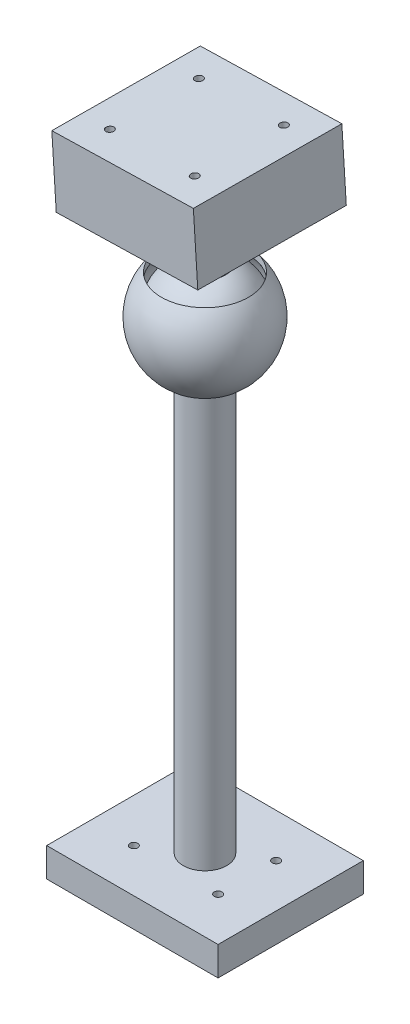
ISO-10303-21;
HEADER;
FILE_DESCRIPTION(('STEP AP214'),'2;1');
FILE_NAME('part.step','',(''),(''),'','','');
FILE_SCHEMA(('AUTOMOTIVE_DESIGN { 1 0 10303 214 1 1 1 1 }'));
ENDSEC;
DATA;
#1=APPLICATION_CONTEXT('core data for automotive mechanical design processes');
#2=APPLICATION_PROTOCOL_DEFINITION('international standard','automotive_design',2000,#1);
#3=PRODUCT_CONTEXT('',#1,'mechanical');
#4=PRODUCT('Part','Part','',(#3));
#5=PRODUCT_RELATED_PRODUCT_CATEGORY('part','',(#4));
#6=PRODUCT_DEFINITION_FORMATION('','',#4);
#7=PRODUCT_DEFINITION_CONTEXT('part definition',#1,'design');
#8=PRODUCT_DEFINITION('design','',#6,#7);
#9=PRODUCT_DEFINITION_SHAPE('','',#8);
#10=(LENGTH_UNIT() NAMED_UNIT(*) SI_UNIT(.MILLI.,.METRE.));
#11=(NAMED_UNIT(*) PLANE_ANGLE_UNIT() SI_UNIT($,.RADIAN.));
#12=(NAMED_UNIT(*) SI_UNIT($,.STERADIAN.) SOLID_ANGLE_UNIT());
#13=UNCERTAINTY_MEASURE_WITH_UNIT(LENGTH_MEASURE(1.E-05),#10,'distance_accuracy_value','');
#14=(GEOMETRIC_REPRESENTATION_CONTEXT(3) GLOBAL_UNCERTAINTY_ASSIGNED_CONTEXT((#13)) GLOBAL_UNIT_ASSIGNED_CONTEXT((#10,
#11,#12)) REPRESENTATION_CONTEXT('',''));
#15=CARTESIAN_POINT('',(0.,0.,0.));
#16=DIRECTION('',(0.,0.,1.));
#17=DIRECTION('',(1.,0.,0.));
#18=AXIS2_PLACEMENT_3D('',#15,#16,#17);
#19=CARTESIAN_POINT('',(9.41113582633295,68.257841333732,1025.00000000001));
#20=DIRECTION('',(0.,0.,-1.));
#21=DIRECTION('',(1.,0.,0.));
#22=AXIS2_PLACEMENT_3D('',#19,#20,#21);
#23=SPHERICAL_SURFACE('',#22,20.);
#24=CARTESIAN_POINT('',(9.41113582633295,68.257841333732,1025.00000000001));
#25=DIRECTION('',(0.,-1.,0.));
#26=DIRECTION('',(0.,0.,-1.));
#27=AXIS2_PLACEMENT_3D('',#24,#25,#26);
#28=SPHERICAL_SURFACE('',#27,20.);
#29=CARTESIAN_POINT('',(9.41113582633295,81.4865978890549,1025.00000000001));
#30=DIRECTION('',(0.,-1.,0.));
#31=DIRECTION('',(0.,0.,-1.));
#32=AXIS2_PLACEMENT_3D('',#29,#30,#31);
#33=CIRCLE('',#32,15.);
#34=CARTESIAN_POINT('',(9.41113582633295,81.4865978890549,1010.00000000001));
#35=VERTEX_POINT('',#34);
#36=EDGE_CURVE('P0_E10',#35,#35,#33,.F.);
#37=ORIENTED_EDGE('',*,*,#36,.F.);
#38=EDGE_LOOP('',(#37));
#39=FACE_BOUND('',#38,.T.);
#40=ADVANCED_FACE('P0_F15',(#39),#28,.T.);
#41=CARTESIAN_POINT('',(9.41113582633295,97.257841333732,1025.00000000001));
#42=DIRECTION('',(0.,-1.,0.));
#43=DIRECTION('',(0.,0.,-1.));
#44=AXIS2_PLACEMENT_3D('',#41,#42,#43);
#45=CYLINDRICAL_SURFACE('',#44,15.);
#46=CARTESIAN_POINT('',(9.41113582633295,79.0860452475858,1025.00000000001));
#47=DIRECTION('',(0.,-1.,0.));
#48=DIRECTION('',(0.,0.,-1.));
#49=AXIS2_PLACEMENT_3D('',#46,#47,#48);
#50=CIRCLE('',#49,15.);
#51=CARTESIAN_POINT('',(9.41113582633295,79.0860452475858,1010.00000000001));
#52=VERTEX_POINT('',#51);
#53=EDGE_CURVE('P0_E18',#52,#52,#50,.F.);
#54=ORIENTED_EDGE('',*,*,#53,.F.);
#55=EDGE_LOOP('',(#54));
#56=FACE_BOUND('',#55,.T.);
#57=ORIENTED_EDGE('',*,*,#36,.T.);
#58=EDGE_LOOP('',(#57));
#59=FACE_BOUND('',#58,.T.);
#60=ADVANCED_FACE('P0_F29',(#56,#59),#45,.F.);
#61=CARTESIAN_POINT('',(9.41113582633295,68.257841333732,1025.00000000001));
#62=DIRECTION('',(0.,0.,-1.));
#63=DIRECTION('',(1.,0.,0.));
#64=AXIS2_PLACEMENT_3D('',#61,#62,#63);
#65=SPHERICAL_SURFACE('',#64,18.5);
#66=CARTESIAN_POINT('',(9.41113582633295,68.257841333732,1025.00000000001));
#67=DIRECTION('',(0.,-1.,0.));
#68=DIRECTION('',(0.,0.,-1.));
#69=AXIS2_PLACEMENT_3D('',#66,#67,#68);
#70=SPHERICAL_SURFACE('',#69,18.5);
#71=ORIENTED_EDGE('',*,*,#53,.T.);
#72=EDGE_LOOP('',(#71));
#73=FACE_BOUND('',#72,.T.);
#74=ADVANCED_FACE('P0_F27',(#73),#70,.F.);
#75=CLOSED_SHELL('',(#40,#60,#74));
#76=MANIFOLD_SOLID_BREP('P0_B1',#75);
#77=CARTESIAN_POINT('',(38.9111358263329,-91.742158666268,1050.00000000001));
#78=DIRECTION('',(-1.,0.,0.));
#79=DIRECTION('',(0.,0.,1.));
#80=AXIS2_PLACEMENT_3D('',#77,#78,#79);
#81=PLANE('',#80);
#82=DIRECTION('',(0.,0.,1.));
#83=VECTOR('',#82,1.);
#84=CARTESIAN_POINT('',(38.9111358263329,-101.742158666268,1050.00000000001));
#85=LINE('',#84,#83);
#86=CARTESIAN_POINT('',(38.9111358263329,-101.742158666268,1000.00000000001));
#87=VERTEX_POINT('',#86);
#88=CARTESIAN_POINT('',(38.9111358263329,-101.742158666268,1050.00000000001));
#89=VERTEX_POINT('',#88);
#90=EDGE_CURVE('P1_E33',#87,#89,#85,.T.);
#91=ORIENTED_EDGE('',*,*,#90,.F.);
#92=DIRECTION('',(0.,-1.,0.));
#93=VECTOR('',#92,1.);
#94=CARTESIAN_POINT('',(38.9111358263329,-91.742158666268,1000.00000000001));
#95=LINE('',#94,#93);
#96=CARTESIAN_POINT('',(38.9111358263329,-91.742158666268,1000.00000000001));
#97=VERTEX_POINT('',#96);
#98=EDGE_CURVE('P1_E25',#97,#87,#95,.T.);
#99=ORIENTED_EDGE('',*,*,#98,.F.);
#100=DIRECTION('',(0.,0.,-1.));
#101=VECTOR('',#100,1.);
#102=CARTESIAN_POINT('',(38.9111358263329,-91.742158666268,1050.00000000001));
#103=LINE('',#102,#101);
#104=CARTESIAN_POINT('',(38.9111358263329,-91.742158666268,1050.00000000001));
#105=VERTEX_POINT('',#104);
#106=EDGE_CURVE('P1_E103',#105,#97,#103,.T.);
#107=ORIENTED_EDGE('',*,*,#106,.F.);
#108=DIRECTION('',(0.,-1.,0.));
#109=VECTOR('',#108,1.);
#110=CARTESIAN_POINT('',(38.9111358263329,-91.742158666268,1050.00000000001));
#111=LINE('',#110,#109);
#112=EDGE_CURVE('P1_E78',#105,#89,#111,.T.);
#113=ORIENTED_EDGE('',*,*,#112,.T.);
#114=EDGE_LOOP('',(#91,#99,#107,#113));
#115=FACE_BOUND('',#114,.T.);
#116=ADVANCED_FACE('P1_F17',(#115),#81,.F.);
#117=CARTESIAN_POINT('',(-20.088864173667,-91.742158666268,1000.00000000001));
#118=DIRECTION('',(0.,0.,1.));
#119=DIRECTION('',(1.,0.,0.));
#120=AXIS2_PLACEMENT_3D('',#117,#118,#119);
#121=PLANE('',#120);
#122=DIRECTION('',(1.,0.,0.));
#123=VECTOR('',#122,1.);
#124=CARTESIAN_POINT('',(-20.088864173667,-101.742158666268,1000.00000000001));
#125=LINE('',#124,#123);
#126=CARTESIAN_POINT('',(-20.088864173667,-101.742158666268,1000.00000000001));
#127=VERTEX_POINT('',#126);
#128=EDGE_CURVE('P1_E75',#127,#87,#125,.T.);
#129=ORIENTED_EDGE('',*,*,#128,.F.);
#130=DIRECTION('',(0.,-1.,0.));
#131=VECTOR('',#130,1.);
#132=CARTESIAN_POINT('',(-20.088864173667,-91.742158666268,1000.00000000001));
#133=LINE('',#132,#131);
#134=CARTESIAN_POINT('',(-20.088864173667,-91.742158666268,1000.00000000001));
#135=VERTEX_POINT('',#134);
#136=EDGE_CURVE('P1_E74',#135,#127,#133,.T.);
#137=ORIENTED_EDGE('',*,*,#136,.F.);
#138=DIRECTION('',(-1.,0.,0.));
#139=VECTOR('',#138,1.);
#140=CARTESIAN_POINT('',(-20.088864173667,-91.742158666268,1000.00000000001));
#141=LINE('',#140,#139);
#142=EDGE_CURVE('P1_E106',#97,#135,#141,.T.);
#143=ORIENTED_EDGE('',*,*,#142,.F.);
#144=ORIENTED_EDGE('',*,*,#98,.T.);
#145=EDGE_LOOP('',(#129,#137,#143,#144));
#146=FACE_BOUND('',#145,.T.);
#147=ADVANCED_FACE('P1_F113',(#146),#121,.F.);
#148=CARTESIAN_POINT('',(-20.088864173667,-91.742158666268,1050.00000000001));
#149=DIRECTION('',(1.,0.,0.));
#150=DIRECTION('',(0.,0.,-1.));
#151=AXIS2_PLACEMENT_3D('',#148,#149,#150);
#152=PLANE('',#151);
#153=DIRECTION('',(0.,0.,-1.));
#154=VECTOR('',#153,1.);
#155=CARTESIAN_POINT('',(-20.088864173667,-101.742158666268,1050.00000000001));
#156=LINE('',#155,#154);
#157=CARTESIAN_POINT('',(-20.088864173667,-101.742158666268,1050.00000000001));
#158=VERTEX_POINT('',#157);
#159=EDGE_CURVE('P1_E60',#158,#127,#156,.T.);
#160=ORIENTED_EDGE('',*,*,#159,.F.);
#161=DIRECTION('',(0.,-1.,0.));
#162=VECTOR('',#161,1.);
#163=CARTESIAN_POINT('',(-20.088864173667,-91.742158666268,1050.00000000001));
#164=LINE('',#163,#162);
#165=CARTESIAN_POINT('',(-20.088864173667,-91.742158666268,1050.00000000001));
#166=VERTEX_POINT('',#165);
#167=EDGE_CURVE('P1_E72',#166,#158,#164,.T.);
#168=ORIENTED_EDGE('',*,*,#167,.F.);
#169=DIRECTION('',(0.,0.,1.));
#170=VECTOR('',#169,1.);
#171=CARTESIAN_POINT('',(-20.088864173667,-91.742158666268,1050.00000000001));
#172=LINE('',#171,#170);
#173=EDGE_CURVE('P1_E108',#135,#166,#172,.T.);
#174=ORIENTED_EDGE('',*,*,#173,.F.);
#175=ORIENTED_EDGE('',*,*,#136,.T.);
#176=EDGE_LOOP('',(#160,#168,#174,#175));
#177=FACE_BOUND('',#176,.T.);
#178=ADVANCED_FACE('P1_F70',(#177),#152,.F.);
#179=CARTESIAN_POINT('',(-20.088864173667,-91.742158666268,1050.00000000001));
#180=DIRECTION('',(0.,0.,-1.));
#181=DIRECTION('',(-1.,0.,0.));
#182=AXIS2_PLACEMENT_3D('',#179,#180,#181);
#183=PLANE('',#182);
#184=DIRECTION('',(-1.,0.,0.));
#185=VECTOR('',#184,1.);
#186=CARTESIAN_POINT('',(-20.088864173667,-101.742158666268,1050.00000000001));
#187=LINE('',#186,#185);
#188=EDGE_CURVE('P1_E57',#89,#158,#187,.T.);
#189=ORIENTED_EDGE('',*,*,#188,.F.);
#190=ORIENTED_EDGE('',*,*,#112,.F.);
#191=DIRECTION('',(1.,0.,0.));
#192=VECTOR('',#191,1.);
#193=CARTESIAN_POINT('',(-20.088864173667,-91.742158666268,1050.00000000001));
#194=LINE('',#193,#192);
#195=EDGE_CURVE('P1_E41',#166,#105,#194,.T.);
#196=ORIENTED_EDGE('',*,*,#195,.F.);
#197=ORIENTED_EDGE('',*,*,#167,.T.);
#198=EDGE_LOOP('',(#189,#190,#196,#197));
#199=FACE_BOUND('',#198,.T.);
#200=ADVANCED_FACE('P1_F77',(#199),#183,.F.);
#201=CARTESIAN_POINT('',(-5.08886417366705,-116.742158666268,1015.00000000001));
#202=DIRECTION('',(0.,1.,0.));
#203=DIRECTION('',(0.,0.,1.));
#204=AXIS2_PLACEMENT_3D('',#201,#202,#203);
#205=CYLINDRICAL_SURFACE('',#204,1.35);
#206=CARTESIAN_POINT('',(-5.08886417366705,-91.742158666268,1015.00000000001));
#207=DIRECTION('',(0.,1.,0.));
#208=DIRECTION('',(0.,0.,1.));
#209=AXIS2_PLACEMENT_3D('',#206,#207,#208);
#210=CIRCLE('',#209,1.35);
#211=CARTESIAN_POINT('',(-5.08886417366705,-91.742158666268,1016.35000000001));
#212=VERTEX_POINT('',#211);
#213=EDGE_CURVE('P1_E99',#212,#212,#210,.T.);
#214=ORIENTED_EDGE('',*,*,#213,.T.);
#215=EDGE_LOOP('',(#214));
#216=FACE_BOUND('',#215,.T.);
#217=CARTESIAN_POINT('',(-5.08886417366705,-101.742158666268,1015.00000000001));
#218=DIRECTION('',(0.,-1.,0.));
#219=DIRECTION('',(0.,0.,-1.));
#220=AXIS2_PLACEMENT_3D('',#217,#218,#219);
#221=CIRCLE('',#220,1.35);
#222=CARTESIAN_POINT('',(-5.08886417366705,-101.742158666268,1013.65000000001));
#223=VERTEX_POINT('',#222);
#224=EDGE_CURVE('P1_E65',#223,#223,#221,.F.);
#225=ORIENTED_EDGE('',*,*,#224,.F.);
#226=EDGE_LOOP('',(#225));
#227=FACE_BOUND('',#226,.T.);
#228=ADVANCED_FACE('P1_F127',(#216,#227),#205,.F.);
#229=CARTESIAN_POINT('',(23.9111358263329,-116.742158666268,1015.00000000001));
#230=DIRECTION('',(0.,1.,0.));
#231=DIRECTION('',(0.,0.,1.));
#232=AXIS2_PLACEMENT_3D('',#229,#230,#231);
#233=CYLINDRICAL_SURFACE('',#232,1.35);
#234=CARTESIAN_POINT('',(23.9111358263329,-91.742158666268,1015.00000000001));
#235=DIRECTION('',(0.,1.,0.));
#236=DIRECTION('',(0.,0.,-1.));
#237=AXIS2_PLACEMENT_3D('',#234,#235,#236);
#238=CIRCLE('',#237,1.35);
#239=CARTESIAN_POINT('',(23.9111358263329,-91.742158666268,1013.65000000001));
#240=VERTEX_POINT('',#239);
#241=EDGE_CURVE('P1_E96',#240,#240,#238,.T.);
#242=ORIENTED_EDGE('',*,*,#241,.T.);
#243=EDGE_LOOP('',(#242));
#244=FACE_BOUND('',#243,.T.);
#245=CARTESIAN_POINT('',(23.9111358263329,-101.742158666268,1015.00000000001));
#246=DIRECTION('',(0.,-1.,0.));
#247=DIRECTION('',(0.,0.,-1.));
#248=AXIS2_PLACEMENT_3D('',#245,#246,#247);
#249=CIRCLE('',#248,1.35);
#250=CARTESIAN_POINT('',(23.9111358263329,-101.742158666268,1013.65000000001));
#251=VERTEX_POINT('',#250);
#252=EDGE_CURVE('P1_E163',#251,#251,#249,.F.);
#253=ORIENTED_EDGE('',*,*,#252,.F.);
#254=EDGE_LOOP('',(#253));
#255=FACE_BOUND('',#254,.T.);
#256=ADVANCED_FACE('P1_F139',(#244,#255),#233,.F.);
#257=CARTESIAN_POINT('',(23.9111358263329,-116.742158666268,1035.00000000001));
#258=DIRECTION('',(0.,1.,0.));
#259=DIRECTION('',(0.,0.,1.));
#260=AXIS2_PLACEMENT_3D('',#257,#258,#259);
#261=CYLINDRICAL_SURFACE('',#260,1.35);
#262=CARTESIAN_POINT('',(23.9111358263329,-91.742158666268,1035.00000000001));
#263=DIRECTION('',(0.,1.,0.));
#264=DIRECTION('',(0.,0.,1.));
#265=AXIS2_PLACEMENT_3D('',#262,#263,#264);
#266=CIRCLE('',#265,1.35);
#267=CARTESIAN_POINT('',(23.9111358263329,-91.742158666268,1036.35000000001));
#268=VERTEX_POINT('',#267);
#269=EDGE_CURVE('P1_E91',#268,#268,#266,.T.);
#270=ORIENTED_EDGE('',*,*,#269,.T.);
#271=EDGE_LOOP('',(#270));
#272=FACE_BOUND('',#271,.T.);
#273=CARTESIAN_POINT('',(23.9111358263329,-101.742158666268,1035.00000000001));
#274=DIRECTION('',(0.,-1.,0.));
#275=DIRECTION('',(0.,0.,-1.));
#276=AXIS2_PLACEMENT_3D('',#273,#274,#275);
#277=CIRCLE('',#276,1.35);
#278=CARTESIAN_POINT('',(23.9111358263329,-101.742158666268,1033.65000000001));
#279=VERTEX_POINT('',#278);
#280=EDGE_CURVE('P1_E167',#279,#279,#277,.F.);
#281=ORIENTED_EDGE('',*,*,#280,.F.);
#282=EDGE_LOOP('',(#281));
#283=FACE_BOUND('',#282,.T.);
#284=ADVANCED_FACE('P1_F143',(#272,#283),#261,.F.);
#285=CARTESIAN_POINT('',(-5.08886417366705,-116.742158666268,1035.00000000001));
#286=DIRECTION('',(0.,1.,0.));
#287=DIRECTION('',(0.,0.,1.));
#288=AXIS2_PLACEMENT_3D('',#285,#286,#287);
#289=CYLINDRICAL_SURFACE('',#288,1.35);
#290=CARTESIAN_POINT('',(-5.08886417366705,-91.742158666268,1035.00000000001));
#291=DIRECTION('',(0.,1.,0.));
#292=DIRECTION('',(0.,0.,-1.));
#293=AXIS2_PLACEMENT_3D('',#290,#291,#292);
#294=CIRCLE('',#293,1.35);
#295=CARTESIAN_POINT('',(-5.08886417366705,-91.742158666268,1033.65000000001));
#296=VERTEX_POINT('',#295);
#297=EDGE_CURVE('P1_E87',#296,#296,#294,.T.);
#298=ORIENTED_EDGE('',*,*,#297,.T.);
#299=EDGE_LOOP('',(#298));
#300=FACE_BOUND('',#299,.T.);
#301=CARTESIAN_POINT('',(-5.08886417366705,-101.742158666268,1035.00000000001));
#302=DIRECTION('',(0.,-1.,0.));
#303=DIRECTION('',(0.,0.,-1.));
#304=AXIS2_PLACEMENT_3D('',#301,#302,#303);
#305=CIRCLE('',#304,1.35);
#306=CARTESIAN_POINT('',(-5.08886417366705,-101.742158666268,1033.65000000001));
#307=VERTEX_POINT('',#306);
#308=EDGE_CURVE('P1_E20',#307,#307,#305,.F.);
#309=ORIENTED_EDGE('',*,*,#308,.F.);
#310=EDGE_LOOP('',(#309));
#311=FACE_BOUND('',#310,.T.);
#312=ADVANCED_FACE('P1_F135',(#300,#311),#289,.F.);
#313=CARTESIAN_POINT('',(9.41113582633295,68.257841333732,1025.00000000001));
#314=DIRECTION('',(0.,-1.,0.));
#315=DIRECTION('',(0.,0.,-1.));
#316=AXIS2_PLACEMENT_3D('',#313,#314,#315);
#317=CYLINDRICAL_SURFACE('',#316,7.5);
#318=CARTESIAN_POINT('',(9.41113582633295,-91.742158666268,1025.00000000001));
#319=DIRECTION('',(0.,1.,0.));
#320=DIRECTION('',(0.,0.,1.));
#321=AXIS2_PLACEMENT_3D('',#318,#319,#320);
#322=CIRCLE('',#321,7.5);
#323=CARTESIAN_POINT('',(9.41113582633295,-91.742158666268,1032.50000000001));
#324=VERTEX_POINT('',#323);
#325=EDGE_CURVE('P1_E11',#324,#324,#322,.T.);
#326=ORIENTED_EDGE('',*,*,#325,.T.);
#327=EDGE_LOOP('',(#326));
#328=FACE_BOUND('',#327,.T.);
#329=CARTESIAN_POINT('',(9.41113582633295,51.3463068084442,1025.00000000001));
#330=DIRECTION('',(0.,1.,0.));
#331=DIRECTION('',(0.,0.,1.));
#332=AXIS2_PLACEMENT_3D('',#329,#330,#331);
#333=CIRCLE('',#332,7.5);
#334=CARTESIAN_POINT('',(9.41113582633295,51.3463068084442,1032.50000000001));
#335=VERTEX_POINT('',#334);
#336=EDGE_CURVE('P1_E85',#335,#335,#333,.T.);
#337=ORIENTED_EDGE('',*,*,#336,.F.);
#338=EDGE_LOOP('',(#337));
#339=FACE_BOUND('',#338,.T.);
#340=ADVANCED_FACE('P1_F131',(#328,#339),#317,.T.);
#341=CARTESIAN_POINT('',(9.41113582633295,-91.742158666268,1025.00000000001));
#342=DIRECTION('',(0.,-1.,0.));
#343=DIRECTION('',(0.,0.,-1.));
#344=AXIS2_PLACEMENT_3D('',#341,#342,#343);
#345=PLANE('',#344);
#346=ORIENTED_EDGE('',*,*,#297,.F.);
#347=EDGE_LOOP('',(#346));
#348=FACE_BOUND('',#347,.T.);
#349=ORIENTED_EDGE('',*,*,#269,.F.);
#350=EDGE_LOOP('',(#349));
#351=FACE_BOUND('',#350,.T.);
#352=ORIENTED_EDGE('',*,*,#241,.F.);
#353=EDGE_LOOP('',(#352));
#354=FACE_BOUND('',#353,.T.);
#355=ORIENTED_EDGE('',*,*,#213,.F.);
#356=EDGE_LOOP('',(#355));
#357=FACE_BOUND('',#356,.T.);
#358=ORIENTED_EDGE('',*,*,#325,.F.);
#359=EDGE_LOOP('',(#358));
#360=FACE_BOUND('',#359,.T.);
#361=ORIENTED_EDGE('',*,*,#106,.T.);
#362=ORIENTED_EDGE('',*,*,#142,.T.);
#363=ORIENTED_EDGE('',*,*,#173,.T.);
#364=ORIENTED_EDGE('',*,*,#195,.T.);
#365=EDGE_LOOP('',(#361,#362,#363,#364));
#366=FACE_BOUND('',#365,.T.);
#367=ADVANCED_FACE('P1_F109',(#348,#351,#354,#357,#360,#366),#345,.F.);
#368=CARTESIAN_POINT('',(9.41113582633295,68.257841333732,1025.00000000001));
#369=DIRECTION('',(0.,0.,-1.));
#370=DIRECTION('',(1.,0.,0.));
#371=AXIS2_PLACEMENT_3D('',#368,#369,#370);
#372=SPHERICAL_SURFACE('',#371,18.5);
#373=CARTESIAN_POINT('',(9.41113582633295,68.257841333732,1025.00000000001));
#374=DIRECTION('',(0.,1.,0.));
#375=DIRECTION('',(0.,0.,1.));
#376=AXIS2_PLACEMENT_3D('',#373,#374,#375);
#377=SPHERICAL_SURFACE('',#376,18.5);
#378=ORIENTED_EDGE('',*,*,#336,.T.);
#379=EDGE_LOOP('',(#378));
#380=FACE_BOUND('',#379,.T.);
#381=ADVANCED_FACE('P1_F130',(#380),#377,.F.);
#382=CARTESIAN_POINT('',(-28.9241359360102,-101.742158666268,1065.00000000001));
#383=DIRECTION('',(0.,-1.,0.));
#384=DIRECTION('',(0.,0.,-1.));
#385=AXIS2_PLACEMENT_3D('',#382,#383,#384);
#386=PLANE('',#385);
#387=ORIENTED_EDGE('',*,*,#224,.T.);
#388=EDGE_LOOP('',(#387));
#389=FACE_BOUND('',#388,.T.);
#390=ORIENTED_EDGE('',*,*,#252,.T.);
#391=EDGE_LOOP('',(#390));
#392=FACE_BOUND('',#391,.T.);
#393=ORIENTED_EDGE('',*,*,#280,.T.);
#394=EDGE_LOOP('',(#393));
#395=FACE_BOUND('',#394,.T.);
#396=ORIENTED_EDGE('',*,*,#308,.T.);
#397=EDGE_LOOP('',(#396));
#398=FACE_BOUND('',#397,.T.);
#399=ORIENTED_EDGE('',*,*,#90,.T.);
#400=ORIENTED_EDGE('',*,*,#188,.T.);
#401=ORIENTED_EDGE('',*,*,#159,.T.);
#402=ORIENTED_EDGE('',*,*,#128,.T.);
#403=EDGE_LOOP('',(#399,#400,#401,#402));
#404=FACE_BOUND('',#403,.T.);
#405=ADVANCED_FACE('P1_F59',(#389,#392,#395,#398,#404),#386,.T.);
#406=CLOSED_SHELL('',(#116,#147,#178,#200,#228,#256,#284,#312,#340,#367,#381,#405));
#407=MANIFOLD_SOLID_BREP('P1_B1',#406);
#408=CARTESIAN_POINT('',(8.10840548137373,99.6990524685234,1024.97999531164));
#409=DIRECTION('',(-0.0480620882868026,0.998723871746423,0.0155133385622515));
#410=DIRECTION('',(-0.998578492868549,-0.0476851820629795,-0.0238142182739097));
#411=AXIS2_PLACEMENT_3D('',#408,#409,#410);
#412=PLANE('',#411);
#413=CARTESIAN_POINT('',(8.10840548137373,99.6990524685234,1024.97999531164));
#414=DIRECTION('',(-0.0480620882868026,0.998723871746423,0.0155133385622515));
#415=DIRECTION('',(-0.998578492868549,-0.0476851820629795,-0.0238142182739097));
#416=AXIS2_PLACEMENT_3D('',#413,#414,#415);
#417=CIRCLE('',#416,7.5);
#418=CARTESIAN_POINT('',(0.619066784859613,99.3414136030511,1024.80138867458));
#419=VERTEX_POINT('',#418);
#420=EDGE_CURVE('P2_E10',#419,#419,#417,.F.);
#421=ORIENTED_EDGE('',*,*,#420,.F.);
#422=EDGE_LOOP('',(#421));
#423=FACE_BOUND('',#422,.T.);
#424=DIRECTION('',(-0.998578492868549,-0.0476851820629795,-0.0238142182739097));
#425=VECTOR('',#424,1.);
#426=CARTESIAN_POINT('',(32.4967660055028,100.475285837548,1050.56525147025));
#427=LINE('',#426,#425);
#428=CARTESIAN_POINT('',(32.4967660055028,100.475285837548,1050.56525147025));
#429=VERTEX_POINT('',#428);
#430=CARTESIAN_POINT('',(-17.4321586379247,98.0910267343986,1049.37454055656));
#431=VERTEX_POINT('',#430);
#432=EDGE_CURVE('P2_E71',#429,#431,#427,.T.);
#433=ORIENTED_EDGE('',*,*,#432,.T.);
#434=DIRECTION('',(0.0230440719033879,0.0166358473020145,-0.999596028070668));
#435=VECTOR('',#434,1.);
#436=CARTESIAN_POINT('',(-16.2799550427553,98.9228190994993,999.394739153023));
#437=LINE('',#436,#435);
#438=CARTESIAN_POINT('',(-16.2799550427553,98.9228190994993,999.394739153023));
#439=VERTEX_POINT('',#438);
#440=EDGE_CURVE('P2_E66',#431,#439,#437,.T.);
#441=ORIENTED_EDGE('',*,*,#440,.T.);
#442=DIRECTION('',(0.998578492868549,0.0476851820629795,0.0238142182739097));
#443=VECTOR('',#442,1.);
#444=CARTESIAN_POINT('',(33.6489696006722,101.307078202648,1000.58545006672));
#445=LINE('',#444,#443);
#446=CARTESIAN_POINT('',(33.6489696006722,101.307078202648,1000.58545006672));
#447=VERTEX_POINT('',#446);
#448=EDGE_CURVE('P2_E69',#439,#447,#445,.T.);
#449=ORIENTED_EDGE('',*,*,#448,.T.);
#450=DIRECTION('',(-0.0230440719033879,-0.0166358473020145,0.999596028070668));
#451=VECTOR('',#450,1.);
#452=CARTESIAN_POINT('',(33.6489696006722,101.307078202648,1000.58545006672));
#453=LINE('',#452,#451);
#454=EDGE_CURVE('P2_E35',#447,#429,#453,.T.);
#455=ORIENTED_EDGE('',*,*,#454,.T.);
#456=EDGE_LOOP('',(#433,#441,#449,#455));
#457=FACE_BOUND('',#456,.T.);
#458=CARTESIAN_POINT('',(-6.52461083310369,99.2333124471089,1009.62884161647));
#459=DIRECTION('',(0.0480620882868026,-0.998723871746423,-0.0155133385622515));
#460=DIRECTION('',(0.998578492868549,0.0476851820629795,0.0238142182739097));
#461=AXIS2_PLACEMENT_3D('',#458,#459,#460);
#462=CIRCLE('',#461,1.35);
#463=CARTESIAN_POINT('',(-5.17652986773115,99.297687442894,1009.66099081114));
#464=VERTEX_POINT('',#463);
#465=EDGE_CURVE('P2_E88',#464,#464,#462,.T.);
#466=ORIENTED_EDGE('',*,*,#465,.F.);
#467=EDGE_LOOP('',(#466));
#468=FACE_BOUND('',#467,.T.);
#469=CARTESIAN_POINT('',(-7.21593299020533,98.7342370280485,1039.61672245859));
#470=DIRECTION('',(0.0480620882868026,-0.998723871746423,-0.0155133385622515));
#471=DIRECTION('',(-0.998578492868549,-0.0476851820629795,-0.0238142182739097));
#472=AXIS2_PLACEMENT_3D('',#469,#470,#471);
#473=CIRCLE('',#472,1.35);
#474=CARTESIAN_POINT('',(-8.56401395557786,98.6698620322635,1039.58457326392));
#475=VERTEX_POINT('',#474);
#476=EDGE_CURVE('P2_E123',#475,#475,#473,.T.);
#477=ORIENTED_EDGE('',*,*,#476,.F.);
#478=EDGE_LOOP('',(#477));
#479=FACE_BOUND('',#478,.T.);
#480=CARTESIAN_POINT('',(23.4327439529528,100.663867908998,1010.34326816469));
#481=DIRECTION('',(0.0480620882868026,-0.998723871746423,-0.0155133385622515));
#482=DIRECTION('',(-0.998578492868549,-0.0476851820629795,-0.0238142182739097));
#483=AXIS2_PLACEMENT_3D('',#480,#481,#482);
#484=CIRCLE('',#483,1.35);
#485=CARTESIAN_POINT('',(22.0846629875802,100.599492913213,1010.31111897002));
#486=VERTEX_POINT('',#485);
#487=EDGE_CURVE('P2_E118',#486,#486,#484,.T.);
#488=ORIENTED_EDGE('',*,*,#487,.F.);
#489=EDGE_LOOP('',(#488));
#490=FACE_BOUND('',#489,.T.);
#491=CARTESIAN_POINT('',(22.7414217958511,100.164792489938,1040.33114900681));
#492=DIRECTION('',(0.0480620882868026,-0.998723871746423,-0.0155133385622515));
#493=DIRECTION('',(0.998578492868549,0.0476851820629795,0.0238142182739097));
#494=AXIS2_PLACEMENT_3D('',#491,#492,#493);
#495=CIRCLE('',#494,1.35);
#496=CARTESIAN_POINT('',(24.0895027612237,100.229167485723,1040.36329820148));
#497=VERTEX_POINT('',#496);
#498=EDGE_CURVE('P2_E109',#497,#497,#495,.T.);
#499=ORIENTED_EDGE('',*,*,#498,.F.);
#500=EDGE_LOOP('',(#499));
#501=FACE_BOUND('',#500,.T.);
#502=ADVANCED_FACE('P2_F16',(#423,#457,#468,#479,#490,#501),#412,.F.);
#503=CARTESIAN_POINT('',(6.95491536249047,123.668425390438,1025.35231543713));
#504=DIRECTION('',(-0.0480620882868026,0.998723871746423,0.0155133385622515));
#505=DIRECTION('',(-0.998578492868549,-0.0476851820629795,-0.0238142182739097));
#506=AXIS2_PLACEMENT_3D('',#503,#504,#505);
#507=PLANE('',#506);
#508=CARTESIAN_POINT('',(22.2792538340695,124.633240830912,1010.71558829018));
#509=DIRECTION('',(0.0480620882868026,-0.998723871746423,-0.0155133385622515));
#510=DIRECTION('',(-0.998578492868549,-0.0476851820629795,-0.0238142182739097));
#511=AXIS2_PLACEMENT_3D('',#508,#509,#510);
#512=CIRCLE('',#511,1.35);
#513=CARTESIAN_POINT('',(20.931172868697,124.568865835127,1010.68343909551));
#514=VERTEX_POINT('',#513);
#515=EDGE_CURVE('P2_E113',#514,#514,#512,.T.);
#516=ORIENTED_EDGE('',*,*,#515,.T.);
#517=EDGE_LOOP('',(#516));
#518=FACE_BOUND('',#517,.T.);
#519=CARTESIAN_POINT('',(-7.67810095198695,123.202685369023,1010.00116174196));
#520=DIRECTION('',(0.0480620882868026,-0.998723871746423,-0.0155133385622515));
#521=DIRECTION('',(0.998578492868549,0.0476851820629795,0.0238142182739097));
#522=AXIS2_PLACEMENT_3D('',#519,#520,#521);
#523=CIRCLE('',#522,1.35);
#524=CARTESIAN_POINT('',(-6.33001998661441,123.267060364808,1010.03331093663));
#525=VERTEX_POINT('',#524);
#526=EDGE_CURVE('P2_E126',#525,#525,#523,.T.);
#527=ORIENTED_EDGE('',*,*,#526,.T.);
#528=EDGE_LOOP('',(#527));
#529=FACE_BOUND('',#528,.T.);
#530=DIRECTION('',(-0.998578492868549,-0.0476851820629795,-0.0238142182739097));
#531=VECTOR('',#530,1.);
#532=CARTESIAN_POINT('',(31.3432758866195,124.444658759462,1050.93757159575));
#533=LINE('',#532,#531);
#534=CARTESIAN_POINT('',(31.3432758866195,124.444658759462,1050.93757159575));
#535=VERTEX_POINT('',#534);
#536=CARTESIAN_POINT('',(-18.585648756808,122.060399656313,1049.74686068205));
#537=VERTEX_POINT('',#536);
#538=EDGE_CURVE('P2_E85',#535,#537,#533,.T.);
#539=ORIENTED_EDGE('',*,*,#538,.F.);
#540=DIRECTION('',(-0.0230440719033879,-0.0166358473020145,0.999596028070668));
#541=VECTOR('',#540,1.);
#542=CARTESIAN_POINT('',(32.4954794817889,125.276451124562,1000.95777019221));
#543=LINE('',#542,#541);
#544=CARTESIAN_POINT('',(32.4954794817889,125.276451124562,1000.95777019221));
#545=VERTEX_POINT('',#544);
#546=EDGE_CURVE('P2_E58',#545,#535,#543,.T.);
#547=ORIENTED_EDGE('',*,*,#546,.F.);
#548=DIRECTION('',(0.998578492868549,0.0476851820629795,0.0238142182739097));
#549=VECTOR('',#548,1.);
#550=CARTESIAN_POINT('',(32.4954794817889,125.276451124562,1000.95777019221));
#551=LINE('',#550,#549);
#552=CARTESIAN_POINT('',(-17.4334451616386,122.892192021413,999.767059278517));
#553=VERTEX_POINT('',#552);
#554=EDGE_CURVE('P2_E52',#553,#545,#551,.T.);
#555=ORIENTED_EDGE('',*,*,#554,.F.);
#556=DIRECTION('',(0.0230440719033879,0.0166358473020145,-0.999596028070668));
#557=VECTOR('',#556,1.);
#558=CARTESIAN_POINT('',(-17.4334451616386,122.892192021413,999.767059278517));
#559=LINE('',#558,#557);
#560=EDGE_CURVE('P2_E76',#537,#553,#559,.T.);
#561=ORIENTED_EDGE('',*,*,#560,.F.);
#562=EDGE_LOOP('',(#539,#547,#555,#561));
#563=FACE_BOUND('',#562,.T.);
#564=CARTESIAN_POINT('',(-8.36942310908859,122.703609949963,1039.98904258408));
#565=DIRECTION('',(0.0480620882868026,-0.998723871746423,-0.0155133385622515));
#566=DIRECTION('',(-0.998578492868549,-0.0476851820629795,-0.0238142182739097));
#567=AXIS2_PLACEMENT_3D('',#564,#565,#566);
#568=CIRCLE('',#567,1.35);
#569=CARTESIAN_POINT('',(-9.71750407446113,122.639234954178,1039.95689338941));
#570=VERTEX_POINT('',#569);
#571=EDGE_CURVE('P2_E104',#570,#570,#568,.T.);
#572=ORIENTED_EDGE('',*,*,#571,.T.);
#573=EDGE_LOOP('',(#572));
#574=FACE_BOUND('',#573,.T.);
#575=CARTESIAN_POINT('',(21.5879316769679,124.134165411852,1040.7034691323));
#576=DIRECTION('',(0.0480620882868026,-0.998723871746423,-0.0155133385622515));
#577=DIRECTION('',(0.998578492868549,0.0476851820629795,0.0238142182739097));
#578=AXIS2_PLACEMENT_3D('',#575,#576,#577);
#579=CIRCLE('',#578,1.35);
#580=CARTESIAN_POINT('',(22.9360126423404,124.198540407637,1040.73561832697));
#581=VERTEX_POINT('',#580);
#582=EDGE_CURVE('P2_E107',#581,#581,#579,.T.);
#583=ORIENTED_EDGE('',*,*,#582,.T.);
#584=EDGE_LOOP('',(#583));
#585=FACE_BOUND('',#584,.T.);
#586=ADVANCED_FACE('P2_F96',(#518,#529,#563,#574,#585),#507,.T.);
#587=CARTESIAN_POINT('',(32.4967660055028,100.475285837548,1050.56525147025));
#588=DIRECTION('',(0.0230440719033879,0.0166358473020145,-0.999596028070668));
#589=DIRECTION('',(0.998578492868549,0.0476851820629795,0.0238142182739097));
#590=AXIS2_PLACEMENT_3D('',#587,#588,#589);
#591=PLANE('',#590);
#592=ORIENTED_EDGE('',*,*,#538,.T.);
#593=DIRECTION('',(-0.0480620882868026,0.998723871746423,0.0155133385622515));
#594=VECTOR('',#593,1.);
#595=CARTESIAN_POINT('',(-17.4321586379247,98.0910267343986,1049.37454055656));
#596=LINE('',#595,#594);
#597=EDGE_CURVE('P2_E26',#431,#537,#596,.T.);
#598=ORIENTED_EDGE('',*,*,#597,.F.);
#599=ORIENTED_EDGE('',*,*,#432,.F.);
#600=DIRECTION('',(-0.0480620882868026,0.998723871746423,0.0155133385622515));
#601=VECTOR('',#600,1.);
#602=CARTESIAN_POINT('',(32.4967660055028,100.475285837548,1050.56525147025));
#603=LINE('',#602,#601);
#604=EDGE_CURVE('P2_E81',#429,#535,#603,.T.);
#605=ORIENTED_EDGE('',*,*,#604,.T.);
#606=EDGE_LOOP('',(#592,#598,#599,#605));
#607=FACE_BOUND('',#606,.T.);
#608=ADVANCED_FACE('P2_F18',(#607),#591,.F.);
#609=CARTESIAN_POINT('',(-16.2799550427553,98.9228190994993,999.394739153023));
#610=DIRECTION('',(0.998578492868549,0.0476851820629795,0.0238142182739097));
#611=DIRECTION('',(-0.0230440719033879,-0.0166358473020145,0.999596028070668));
#612=AXIS2_PLACEMENT_3D('',#609,#610,#611);
#613=PLANE('',#612);
#614=ORIENTED_EDGE('',*,*,#560,.T.);
#615=DIRECTION('',(-0.0480620882868026,0.998723871746423,0.0155133385622515));
#616=VECTOR('',#615,1.);
#617=CARTESIAN_POINT('',(-16.2799550427553,98.9228190994993,999.394739153023));
#618=LINE('',#617,#616);
#619=EDGE_CURVE('P2_E74',#439,#553,#618,.T.);
#620=ORIENTED_EDGE('',*,*,#619,.F.);
#621=ORIENTED_EDGE('',*,*,#440,.F.);
#622=ORIENTED_EDGE('',*,*,#597,.T.);
#623=EDGE_LOOP('',(#614,#620,#621,#622));
#624=FACE_BOUND('',#623,.T.);
#625=ADVANCED_FACE('P2_F75',(#624),#613,.F.);
#626=CARTESIAN_POINT('',(33.6489696006722,101.307078202648,1000.58545006672));
#627=DIRECTION('',(-0.0230440719033879,-0.0166358473020145,0.999596028070668));
#628=DIRECTION('',(-0.998578492868549,-0.0476851820629795,-0.0238142182739097));
#629=AXIS2_PLACEMENT_3D('',#626,#627,#628);
#630=PLANE('',#629);
#631=ORIENTED_EDGE('',*,*,#554,.T.);
#632=DIRECTION('',(-0.0480620882868026,0.998723871746423,0.0155133385622515));
#633=VECTOR('',#632,1.);
#634=CARTESIAN_POINT('',(33.6489696006722,101.307078202648,1000.58545006672));
#635=LINE('',#634,#633);
#636=EDGE_CURVE('P2_E77',#447,#545,#635,.T.);
#637=ORIENTED_EDGE('',*,*,#636,.F.);
#638=ORIENTED_EDGE('',*,*,#448,.F.);
#639=ORIENTED_EDGE('',*,*,#619,.T.);
#640=EDGE_LOOP('',(#631,#637,#638,#639));
#641=FACE_BOUND('',#640,.T.);
#642=ADVANCED_FACE('P2_F79',(#641),#630,.F.);
#643=CARTESIAN_POINT('',(33.6489696006722,101.307078202648,1000.58545006672));
#644=DIRECTION('',(-0.998578492868549,-0.0476851820629795,-0.0238142182739097));
#645=DIRECTION('',(0.0230440719033879,0.0166358473020145,-0.999596028070668));
#646=AXIS2_PLACEMENT_3D('',#643,#644,#645);
#647=PLANE('',#646);
#648=ORIENTED_EDGE('',*,*,#546,.T.);
#649=ORIENTED_EDGE('',*,*,#604,.F.);
#650=ORIENTED_EDGE('',*,*,#454,.F.);
#651=ORIENTED_EDGE('',*,*,#636,.T.);
#652=EDGE_LOOP('',(#648,#649,#650,#651));
#653=FACE_BOUND('',#652,.T.);
#654=ADVANCED_FACE('P2_F137',(#653),#647,.F.);
#655=CARTESIAN_POINT('',(-6.52461083310369,99.2333124471089,1009.62884161647));
#656=DIRECTION('',(-0.0480620882868026,0.998723871746423,0.0155133385622515));
#657=DIRECTION('',(-0.998578492868549,-0.0476851820629795,-0.0238142182739097));
#658=AXIS2_PLACEMENT_3D('',#655,#656,#657);
#659=CYLINDRICAL_SURFACE('',#658,1.35);
#660=ORIENTED_EDGE('',*,*,#465,.T.);
#661=EDGE_LOOP('',(#660));
#662=FACE_BOUND('',#661,.T.);
#663=ORIENTED_EDGE('',*,*,#526,.F.);
#664=EDGE_LOOP('',(#663));
#665=FACE_BOUND('',#664,.T.);
#666=ADVANCED_FACE('P2_F134',(#662,#665),#659,.F.);
#667=CARTESIAN_POINT('',(-7.21593299020533,98.7342370280485,1039.61672245859));
#668=DIRECTION('',(-0.0480620882868026,0.998723871746423,0.0155133385622515));
#669=DIRECTION('',(-0.998578492868549,-0.0476851820629795,-0.0238142182739097));
#670=AXIS2_PLACEMENT_3D('',#667,#668,#669);
#671=CYLINDRICAL_SURFACE('',#670,1.35);
#672=ORIENTED_EDGE('',*,*,#476,.T.);
#673=EDGE_LOOP('',(#672));
#674=FACE_BOUND('',#673,.T.);
#675=ORIENTED_EDGE('',*,*,#571,.F.);
#676=EDGE_LOOP('',(#675));
#677=FACE_BOUND('',#676,.T.);
#678=ADVANCED_FACE('P2_F136',(#674,#677),#671,.F.);
#679=CARTESIAN_POINT('',(23.4327439529528,100.663867908998,1010.34326816469));
#680=DIRECTION('',(-0.0480620882868026,0.998723871746423,0.0155133385622515));
#681=DIRECTION('',(-0.998578492868549,-0.0476851820629795,-0.0238142182739097));
#682=AXIS2_PLACEMENT_3D('',#679,#680,#681);
#683=CYLINDRICAL_SURFACE('',#682,1.35);
#684=ORIENTED_EDGE('',*,*,#487,.T.);
#685=EDGE_LOOP('',(#684));
#686=FACE_BOUND('',#685,.T.);
#687=ORIENTED_EDGE('',*,*,#515,.F.);
#688=EDGE_LOOP('',(#687));
#689=FACE_BOUND('',#688,.T.);
#690=ADVANCED_FACE('P2_F145',(#686,#689),#683,.F.);
#691=CARTESIAN_POINT('',(22.7414217958511,100.164792489938,1040.33114900681));
#692=DIRECTION('',(-0.0480620882868026,0.998723871746423,0.0155133385622515));
#693=DIRECTION('',(-0.998578492868549,-0.0476851820629795,-0.0238142182739097));
#694=AXIS2_PLACEMENT_3D('',#691,#692,#693);
#695=CYLINDRICAL_SURFACE('',#694,1.35);
#696=ORIENTED_EDGE('',*,*,#498,.T.);
#697=EDGE_LOOP('',(#696));
#698=FACE_BOUND('',#697,.T.);
#699=ORIENTED_EDGE('',*,*,#582,.F.);
#700=EDGE_LOOP('',(#699));
#701=FACE_BOUND('',#700,.T.);
#702=ADVANCED_FACE('P2_F213',(#698,#701),#695,.F.);
#703=CARTESIAN_POINT('',(8.87739889396257,83.7194705205807,1024.73178189464));
#704=DIRECTION('',(-0.0480620882868026,0.998723871746423,0.0155133385622515));
#705=DIRECTION('',(-0.998578492868549,-0.0476851820629795,-0.0238142182739097));
#706=AXIS2_PLACEMENT_3D('',#703,#704,#705);
#707=CYLINDRICAL_SURFACE('',#706,7.5);
#708=CARTESIAN_POINT('',(8.87739889396257,83.7194705205807,1024.73178189464));
#709=DIRECTION('',(0.0480620882868026,-0.998723871746423,-0.0155133385622515));
#710=DIRECTION('',(0.998578492868549,0.0476851820629795,0.0238142182739097));
#711=AXIS2_PLACEMENT_3D('',#708,#709,#710);
#712=CIRCLE('',#711,7.5);
#713=CARTESIAN_POINT('',(16.3667375904767,84.077109386053,1024.9103885317));
#714=VERTEX_POINT('',#713);
#715=EDGE_CURVE('P2_E110',#714,#714,#712,.T.);
#716=ORIENTED_EDGE('',*,*,#715,.F.);
#717=EDGE_LOOP('',(#716));
#718=FACE_BOUND('',#717,.T.);
#719=ORIENTED_EDGE('',*,*,#420,.T.);
#720=EDGE_LOOP('',(#719));
#721=FACE_BOUND('',#720,.T.);
#722=ADVANCED_FACE('P2_F222',(#718,#721),#707,.T.);
#723=CARTESIAN_POINT('',(8.87739889396257,83.7194705205807,1024.73178189464));
#724=DIRECTION('',(0.0480620882868026,-0.998723871746423,-0.0155133385622515));
#725=DIRECTION('',(0.998578492868549,0.0476851820629795,0.0238142182739097));
#726=AXIS2_PLACEMENT_3D('',#723,#724,#725);
#727=PLANE('',#726);
#728=CARTESIAN_POINT('',(8.87739889396257,83.7194705205807,1024.73178189464));
#729=DIRECTION('',(0.0480620882868026,-0.998723871746423,-0.0155133385622515));
#730=DIRECTION('',(0.998578492868549,0.0476851820629795,0.0238142182739097));
#731=AXIS2_PLACEMENT_3D('',#728,#729,#730);
#732=CIRCLE('',#731,6.87386354243376);
#733=CARTESIAN_POINT('',(15.7414911903501,84.0472519550777,1024.89547758143));
#734=VERTEX_POINT('',#733);
#735=EDGE_CURVE('P2_E20',#734,#734,#732,.F.);
#736=ORIENTED_EDGE('',*,*,#735,.T.);
#737=EDGE_LOOP('',(#736));
#738=FACE_BOUND('',#737,.T.);
#739=ORIENTED_EDGE('',*,*,#715,.T.);
#740=EDGE_LOOP('',(#739));
#741=FACE_BOUND('',#740,.T.);
#742=ADVANCED_FACE('P2_F231',(#738,#741),#727,.T.);
#743=CARTESIAN_POINT('',(9.59833021826461,68.7386124443843,1024.49908181621));
#744=DIRECTION('',(-0.998578492868549,-0.0476851820629795,-0.0238142182739097));
#745=DIRECTION('',(-0.0230440719033879,-0.0166358473020145,0.999596028070668));
#746=AXIS2_PLACEMENT_3D('',#743,#744,#745);
#747=SPHERICAL_SURFACE('',#746,16.5);
#748=CARTESIAN_POINT('',(9.59833021826461,68.7386124443843,1024.49908181621));
#749=DIRECTION('',(0.0480620882868026,-0.998723871746423,-0.0155133385622515));
#750=DIRECTION('',(0.998578492868549,0.0476851820629795,0.0238142182739097));
#751=AXIS2_PLACEMENT_3D('',#748,#749,#750);
#752=SPHERICAL_SURFACE('',#751,16.5);
#753=ORIENTED_EDGE('',*,*,#735,.F.);
#754=EDGE_LOOP('',(#753));
#755=FACE_BOUND('',#754,.T.);
#756=ADVANCED_FACE('P2_F240',(#755),#752,.T.);
#757=CLOSED_SHELL('',(#502,#586,#608,#625,#642,#654,#666,#678,#690,#702,#722,#742,#756));
#758=MANIFOLD_SOLID_BREP('P2_B1',#757);
#759=ADVANCED_BREP_SHAPE_REPRESENTATION('',(#18,#76,#407,#758),#14);
#760=SHAPE_DEFINITION_REPRESENTATION(#9,#759);
ENDSEC;
END-ISO-10303-21;
